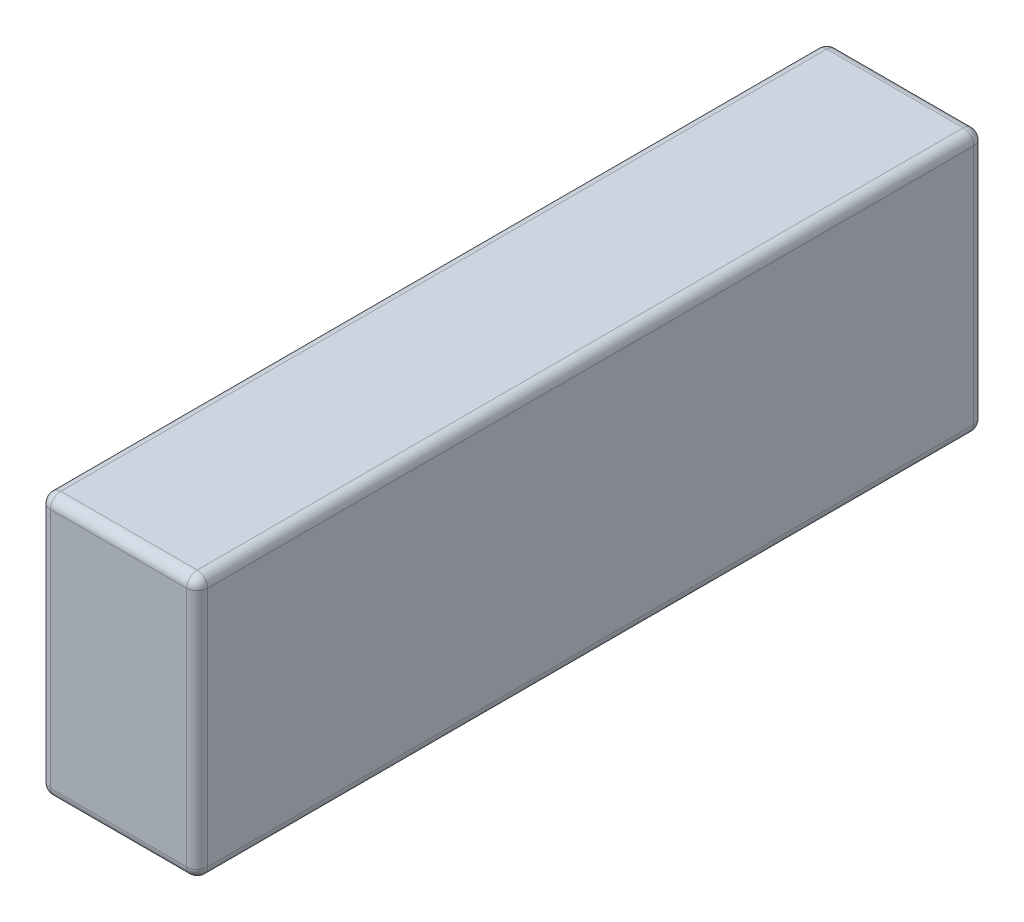
ISO-10303-21;
HEADER;
FILE_DESCRIPTION(('STEP AP214'),'2;1');
FILE_NAME('part.step','',(''),(''),'','','');
FILE_SCHEMA(('AUTOMOTIVE_DESIGN { 1 0 10303 214 1 1 1 1 }'));
ENDSEC;
DATA;
#1=APPLICATION_CONTEXT('core data for automotive mechanical design processes');
#2=APPLICATION_PROTOCOL_DEFINITION('international standard','automotive_design',2000,#1);
#3=PRODUCT_CONTEXT('',#1,'mechanical');
#4=PRODUCT('Part','Part','',(#3));
#5=PRODUCT_RELATED_PRODUCT_CATEGORY('part','',(#4));
#6=PRODUCT_DEFINITION_FORMATION('','',#4);
#7=PRODUCT_DEFINITION_CONTEXT('part definition',#1,'design');
#8=PRODUCT_DEFINITION('design','',#6,#7);
#9=PRODUCT_DEFINITION_SHAPE('','',#8);
#10=(LENGTH_UNIT() NAMED_UNIT(*) SI_UNIT(.MILLI.,.METRE.));
#11=(NAMED_UNIT(*) PLANE_ANGLE_UNIT() SI_UNIT($,.RADIAN.));
#12=(NAMED_UNIT(*) SI_UNIT($,.STERADIAN.) SOLID_ANGLE_UNIT());
#13=UNCERTAINTY_MEASURE_WITH_UNIT(LENGTH_MEASURE(1.E-05),#10,'distance_accuracy_value','');
#14=(GEOMETRIC_REPRESENTATION_CONTEXT(3) GLOBAL_UNCERTAINTY_ASSIGNED_CONTEXT((#13)) GLOBAL_UNIT_ASSIGNED_CONTEXT((#10,
#11,#12)) REPRESENTATION_CONTEXT('',''));
#15=CARTESIAN_POINT('',(0.,0.,0.));
#16=DIRECTION('',(0.,0.,1.));
#17=DIRECTION('',(1.,0.,0.));
#18=AXIS2_PLACEMENT_3D('',#15,#16,#17);
#19=CARTESIAN_POINT('',(3.,2.5,-7.5));
#20=DIRECTION('',(0.,0.,1.));
#21=DIRECTION('',(0.,-1.,0.));
#22=AXIS2_PLACEMENT_3D('',#19,#20,#21);
#23=PLANE('',#22);
#24=DIRECTION('',(0.,1.,0.));
#25=VECTOR('',#24,1.);
#26=CARTESIAN_POINT('',(2.8,-2.5,-7.5));
#27=LINE('',#26,#25);
#28=CARTESIAN_POINT('',(2.8,2.3,-7.5));
#29=VERTEX_POINT('',#28);
#30=CARTESIAN_POINT('',(2.8,-2.3,-7.5));
#31=VERTEX_POINT('',#30);
#32=EDGE_CURVE('E184',#29,#31,#27,.F.);
#33=ORIENTED_EDGE('',*,*,#32,.T.);
#34=DIRECTION('',(-1.,0.,0.));
#35=VECTOR('',#34,1.);
#36=CARTESIAN_POINT('',(3.,-2.3,-7.5));
#37=LINE('',#36,#35);
#38=CARTESIAN_POINT('',(0.2,-2.3,-7.5));
#39=VERTEX_POINT('',#38);
#40=EDGE_CURVE('E188',#31,#39,#37,.T.);
#41=ORIENTED_EDGE('',*,*,#40,.T.);
#42=DIRECTION('',(0.,1.,0.));
#43=VECTOR('',#42,1.);
#44=CARTESIAN_POINT('',(0.2,2.5,-7.5));
#45=LINE('',#44,#43);
#46=CARTESIAN_POINT('',(0.2,2.3,-7.5));
#47=VERTEX_POINT('',#46);
#48=EDGE_CURVE('E186',#39,#47,#45,.T.);
#49=ORIENTED_EDGE('',*,*,#48,.T.);
#50=DIRECTION('',(-1.,0.,0.));
#51=VECTOR('',#50,1.);
#52=CARTESIAN_POINT('',(3.,2.3,-7.5));
#53=LINE('',#52,#51);
#54=EDGE_CURVE('E182',#47,#29,#53,.F.);
#55=ORIENTED_EDGE('',*,*,#54,.T.);
#56=EDGE_LOOP('',(#33,#41,#49,#55));
#57=FACE_BOUND('',#56,.T.);
#58=ADVANCED_FACE('F33',(#57),#23,.F.);
#59=CARTESIAN_POINT('',(3.,2.5,7.5));
#60=DIRECTION('',(0.,-1.,0.));
#61=DIRECTION('',(0.,0.,-1.));
#62=AXIS2_PLACEMENT_3D('',#59,#60,#61);
#63=PLANE('',#62);
#64=DIRECTION('',(0.,0.,1.));
#65=VECTOR('',#64,1.);
#66=CARTESIAN_POINT('',(0.2,2.5,7.5));
#67=LINE('',#66,#65);
#68=CARTESIAN_POINT('',(0.2,2.5,-7.3));
#69=VERTEX_POINT('',#68);
#70=CARTESIAN_POINT('',(0.2,2.5,7.3));
#71=VERTEX_POINT('',#70);
#72=EDGE_CURVE('E42',#69,#71,#67,.T.);
#73=ORIENTED_EDGE('',*,*,#72,.T.);
#74=DIRECTION('',(-1.,0.,0.));
#75=VECTOR('',#74,1.);
#76=CARTESIAN_POINT('',(3.,2.5,7.3));
#77=LINE('',#76,#75);
#78=CARTESIAN_POINT('',(2.8,2.5,7.3));
#79=VERTEX_POINT('',#78);
#80=EDGE_CURVE('E11',#71,#79,#77,.F.);
#81=ORIENTED_EDGE('',*,*,#80,.T.);
#82=DIRECTION('',(0.,0.,1.));
#83=VECTOR('',#82,1.);
#84=CARTESIAN_POINT('',(2.8,2.5,-7.5));
#85=LINE('',#84,#83);
#86=CARTESIAN_POINT('',(2.8,2.5,-7.3));
#87=VERTEX_POINT('',#86);
#88=EDGE_CURVE('E199',#79,#87,#85,.F.);
#89=ORIENTED_EDGE('',*,*,#88,.T.);
#90=DIRECTION('',(-1.,0.,0.));
#91=VECTOR('',#90,1.);
#92=CARTESIAN_POINT('',(3.,2.5,-7.3));
#93=LINE('',#92,#91);
#94=EDGE_CURVE('E53',#87,#69,#93,.T.);
#95=ORIENTED_EDGE('',*,*,#94,.T.);
#96=EDGE_LOOP('',(#73,#81,#89,#95));
#97=FACE_BOUND('',#96,.T.);
#98=ADVANCED_FACE('F330',(#97),#63,.F.);
#99=CARTESIAN_POINT('',(3.,2.5,7.5));
#100=DIRECTION('',(0.,0.,-1.));
#101=DIRECTION('',(0.,1.,0.));
#102=AXIS2_PLACEMENT_3D('',#99,#100,#101);
#103=PLANE('',#102);
#104=DIRECTION('',(-1.,0.,0.));
#105=VECTOR('',#104,1.);
#106=CARTESIAN_POINT('',(3.,2.3,7.5));
#107=LINE('',#106,#105);
#108=CARTESIAN_POINT('',(2.8,2.3,7.5));
#109=VERTEX_POINT('',#108);
#110=CARTESIAN_POINT('',(0.2,2.3,7.5));
#111=VERTEX_POINT('',#110);
#112=EDGE_CURVE('E126',#109,#111,#107,.T.);
#113=ORIENTED_EDGE('',*,*,#112,.T.);
#114=DIRECTION('',(0.,-1.,0.));
#115=VECTOR('',#114,1.);
#116=CARTESIAN_POINT('',(0.2,2.5,7.5));
#117=LINE('',#116,#115);
#118=CARTESIAN_POINT('',(0.2,-2.3,7.5));
#119=VERTEX_POINT('',#118);
#120=EDGE_CURVE('E162',#111,#119,#117,.T.);
#121=ORIENTED_EDGE('',*,*,#120,.T.);
#122=DIRECTION('',(-1.,0.,0.));
#123=VECTOR('',#122,1.);
#124=CARTESIAN_POINT('',(3.,-2.3,7.5));
#125=LINE('',#124,#123);
#126=CARTESIAN_POINT('',(2.8,-2.3,7.5));
#127=VERTEX_POINT('',#126);
#128=EDGE_CURVE('E129',#119,#127,#125,.F.);
#129=ORIENTED_EDGE('',*,*,#128,.T.);
#130=DIRECTION('',(0.,-1.,0.));
#131=VECTOR('',#130,1.);
#132=CARTESIAN_POINT('',(2.8,2.5,7.5));
#133=LINE('',#132,#131);
#134=EDGE_CURVE('E121',#127,#109,#133,.F.);
#135=ORIENTED_EDGE('',*,*,#134,.T.);
#136=EDGE_LOOP('',(#113,#121,#129,#135));
#137=FACE_BOUND('',#136,.T.);
#138=ADVANCED_FACE('F123',(#137),#103,.F.);
#139=CARTESIAN_POINT('',(3.,-2.5,7.5));
#140=DIRECTION('',(0.,1.,0.));
#141=DIRECTION('',(0.,0.,1.));
#142=AXIS2_PLACEMENT_3D('',#139,#140,#141);
#143=PLANE('',#142);
#144=DIRECTION('',(0.,0.,-1.));
#145=VECTOR('',#144,1.);
#146=CARTESIAN_POINT('',(2.8,-2.5,7.5));
#147=LINE('',#146,#145);
#148=CARTESIAN_POINT('',(2.8,-2.5,-7.3));
#149=VERTEX_POINT('',#148);
#150=CARTESIAN_POINT('',(2.8,-2.5,7.3));
#151=VERTEX_POINT('',#150);
#152=EDGE_CURVE('E173',#149,#151,#147,.F.);
#153=ORIENTED_EDGE('',*,*,#152,.T.);
#154=DIRECTION('',(-1.,0.,0.));
#155=VECTOR('',#154,1.);
#156=CARTESIAN_POINT('',(3.,-2.5,7.3));
#157=LINE('',#156,#155);
#158=CARTESIAN_POINT('',(0.2,-2.5,7.3));
#159=VERTEX_POINT('',#158);
#160=EDGE_CURVE('E179',#151,#159,#157,.T.);
#161=ORIENTED_EDGE('',*,*,#160,.T.);
#162=DIRECTION('',(0.,0.,-1.));
#163=VECTOR('',#162,1.);
#164=CARTESIAN_POINT('',(0.2,-2.5,7.5));
#165=LINE('',#164,#163);
#166=CARTESIAN_POINT('',(0.2,-2.5,-7.3));
#167=VERTEX_POINT('',#166);
#168=EDGE_CURVE('E177',#159,#167,#165,.T.);
#169=ORIENTED_EDGE('',*,*,#168,.T.);
#170=DIRECTION('',(-1.,0.,0.));
#171=VECTOR('',#170,1.);
#172=CARTESIAN_POINT('',(3.,-2.5,-7.3));
#173=LINE('',#172,#171);
#174=EDGE_CURVE('E175',#167,#149,#173,.F.);
#175=ORIENTED_EDGE('',*,*,#174,.T.);
#176=EDGE_LOOP('',(#153,#161,#169,#175));
#177=FACE_BOUND('',#176,.T.);
#178=ADVANCED_FACE('F277',(#177),#143,.F.);
#179=CARTESIAN_POINT('',(3.,0.,0.));
#180=DIRECTION('',(1.,0.,0.));
#181=DIRECTION('',(0.,0.,-1.));
#182=AXIS2_PLACEMENT_3D('',#179,#180,#181);
#183=PLANE('',#182);
#184=DIRECTION('',(0.,-1.,0.));
#185=VECTOR('',#184,1.);
#186=CARTESIAN_POINT('',(3.,-2.5,7.3));
#187=LINE('',#186,#185);
#188=CARTESIAN_POINT('',(3.,2.3,7.3));
#189=VERTEX_POINT('',#188);
#190=CARTESIAN_POINT('',(3.,-2.3,7.3));
#191=VERTEX_POINT('',#190);
#192=EDGE_CURVE('E139',#189,#191,#187,.T.);
#193=ORIENTED_EDGE('',*,*,#192,.T.);
#194=DIRECTION('',(0.,0.,-1.));
#195=VECTOR('',#194,1.);
#196=CARTESIAN_POINT('',(3.,-2.3,-7.5));
#197=LINE('',#196,#195);
#198=CARTESIAN_POINT('',(3.,-2.3,-7.3));
#199=VERTEX_POINT('',#198);
#200=EDGE_CURVE('E196',#191,#199,#197,.T.);
#201=ORIENTED_EDGE('',*,*,#200,.T.);
#202=DIRECTION('',(0.,1.,0.));
#203=VECTOR('',#202,1.);
#204=CARTESIAN_POINT('',(3.,2.5,-7.3));
#205=LINE('',#204,#203);
#206=CARTESIAN_POINT('',(3.,2.3,-7.3));
#207=VERTEX_POINT('',#206);
#208=EDGE_CURVE('E194',#199,#207,#205,.T.);
#209=ORIENTED_EDGE('',*,*,#208,.T.);
#210=DIRECTION('',(0.,0.,1.));
#211=VECTOR('',#210,1.);
#212=CARTESIAN_POINT('',(3.,2.3,7.5));
#213=LINE('',#212,#211);
#214=EDGE_CURVE('E191',#207,#189,#213,.T.);
#215=ORIENTED_EDGE('',*,*,#214,.T.);
#216=EDGE_LOOP('',(#193,#201,#209,#215));
#217=FACE_BOUND('',#216,.T.);
#218=ADVANCED_FACE('F264',(#217),#183,.T.);
#219=CARTESIAN_POINT('',(0.,0.,0.));
#220=DIRECTION('',(1.,0.,0.));
#221=DIRECTION('',(0.,0.,-1.));
#222=AXIS2_PLACEMENT_3D('',#219,#220,#221);
#223=PLANE('',#222);
#224=DIRECTION('',(0.,0.,-1.));
#225=VECTOR('',#224,1.);
#226=CARTESIAN_POINT('',(0.,-2.3,0.));
#227=LINE('',#226,#225);
#228=CARTESIAN_POINT('',(0.,-2.3,-7.3));
#229=VERTEX_POINT('',#228);
#230=CARTESIAN_POINT('',(0.,-2.3,7.3));
#231=VERTEX_POINT('',#230);
#232=EDGE_CURVE('E168',#229,#231,#227,.F.);
#233=ORIENTED_EDGE('',*,*,#232,.T.);
#234=DIRECTION('',(0.,-1.,0.));
#235=VECTOR('',#234,1.);
#236=CARTESIAN_POINT('',(0.,0.,7.3));
#237=LINE('',#236,#235);
#238=CARTESIAN_POINT('',(0.,2.3,7.3));
#239=VERTEX_POINT('',#238);
#240=EDGE_CURVE('E170',#231,#239,#237,.F.);
#241=ORIENTED_EDGE('',*,*,#240,.T.);
#242=DIRECTION('',(0.,0.,1.));
#243=VECTOR('',#242,1.);
#244=CARTESIAN_POINT('',(0.,2.3,0.));
#245=LINE('',#244,#243);
#246=CARTESIAN_POINT('',(0.,2.3,-7.3));
#247=VERTEX_POINT('',#246);
#248=EDGE_CURVE('E164',#239,#247,#245,.F.);
#249=ORIENTED_EDGE('',*,*,#248,.T.);
#250=DIRECTION('',(0.,1.,0.));
#251=VECTOR('',#250,1.);
#252=CARTESIAN_POINT('',(0.,0.,-7.3));
#253=LINE('',#252,#251);
#254=EDGE_CURVE('E166',#247,#229,#253,.F.);
#255=ORIENTED_EDGE('',*,*,#254,.T.);
#256=EDGE_LOOP('',(#233,#241,#249,#255));
#257=FACE_BOUND('',#256,.T.);
#258=ADVANCED_FACE('F320',(#257),#223,.F.);
#259=CARTESIAN_POINT('',(2.8,0.,-7.3));
#260=DIRECTION('',(0.,-1.,0.));
#261=DIRECTION('',(0.,0.,-1.));
#262=AXIS2_PLACEMENT_3D('',#259,#260,#261);
#263=CYLINDRICAL_SURFACE('',#262,0.2);
#264=CARTESIAN_POINT('',(2.8,2.3,-7.3));
#265=DIRECTION('',(0.,1.,0.));
#266=DIRECTION('',(0.,0.,1.));
#267=AXIS2_PLACEMENT_3D('',#264,#265,#266);
#268=CIRCLE('',#267,0.2);
#269=EDGE_CURVE('E37',#207,#29,#268,.T.);
#270=ORIENTED_EDGE('',*,*,#269,.F.);
#271=ORIENTED_EDGE('',*,*,#208,.F.);
#272=CARTESIAN_POINT('',(2.8,-2.3,-7.3));
#273=DIRECTION('',(0.,-1.,0.));
#274=DIRECTION('',(1.,0.,0.));
#275=AXIS2_PLACEMENT_3D('',#272,#273,#274);
#276=CIRCLE('',#275,0.2);
#277=EDGE_CURVE('E159',#31,#199,#276,.T.);
#278=ORIENTED_EDGE('',*,*,#277,.F.);
#279=ORIENTED_EDGE('',*,*,#32,.F.);
#280=EDGE_LOOP('',(#270,#271,#278,#279));
#281=FACE_BOUND('',#280,.T.);
#282=ADVANCED_FACE('F35',(#281),#263,.T.);
#283=CARTESIAN_POINT('',(2.8,2.3,-7.3));
#284=DIRECTION('',(0.,0.,-1.));
#285=DIRECTION('',(-1.,0.,0.));
#286=AXIS2_PLACEMENT_3D('',#283,#284,#285);
#287=SPHERICAL_SURFACE('',#286,0.2);
#288=CARTESIAN_POINT('',(2.8,2.3,-7.3));
#289=DIRECTION('',(0.,0.,-1.));
#290=DIRECTION('',(-1.,0.,0.));
#291=AXIS2_PLACEMENT_3D('',#288,#289,#290);
#292=CIRCLE('',#291,0.2);
#293=EDGE_CURVE('E244',#207,#87,#292,.F.);
#294=ORIENTED_EDGE('',*,*,#293,.F.);
#295=ORIENTED_EDGE('',*,*,#269,.T.);
#296=CARTESIAN_POINT('',(2.8,2.3,-7.3));
#297=DIRECTION('',(1.,0.,0.));
#298=DIRECTION('',(0.,0.,-1.));
#299=AXIS2_PLACEMENT_3D('',#296,#297,#298);
#300=CIRCLE('',#299,0.2);
#301=EDGE_CURVE('E247',#87,#29,#300,.F.);
#302=ORIENTED_EDGE('',*,*,#301,.F.);
#303=EDGE_LOOP('',(#294,#295,#302));
#304=FACE_BOUND('',#303,.T.);
#305=ADVANCED_FACE('F287',(#304),#287,.T.);
#306=CARTESIAN_POINT('',(2.8,-2.3,-7.3));
#307=DIRECTION('',(1.,0.,0.));
#308=DIRECTION('',(0.,0.,-1.));
#309=AXIS2_PLACEMENT_3D('',#306,#307,#308);
#310=SPHERICAL_SURFACE('',#309,0.2);
#311=CARTESIAN_POINT('',(2.8,-2.3,-7.3));
#312=DIRECTION('',(1.,0.,0.));
#313=DIRECTION('',(0.,0.,-1.));
#314=AXIS2_PLACEMENT_3D('',#311,#312,#313);
#315=CIRCLE('',#314,0.2);
#316=EDGE_CURVE('E239',#31,#149,#315,.F.);
#317=ORIENTED_EDGE('',*,*,#316,.F.);
#318=ORIENTED_EDGE('',*,*,#277,.T.);
#319=CARTESIAN_POINT('',(2.8,-2.3,-7.3));
#320=DIRECTION('',(0.,0.,-1.));
#321=DIRECTION('',(-1.,0.,0.));
#322=AXIS2_PLACEMENT_3D('',#319,#320,#321);
#323=CIRCLE('',#322,0.2);
#324=EDGE_CURVE('E242',#149,#199,#323,.F.);
#325=ORIENTED_EDGE('',*,*,#324,.F.);
#326=EDGE_LOOP('',(#317,#318,#325));
#327=FACE_BOUND('',#326,.T.);
#328=ADVANCED_FACE('F255',(#327),#310,.T.);
#329=CARTESIAN_POINT('',(3.,2.3,-7.3));
#330=DIRECTION('',(-1.,0.,0.));
#331=DIRECTION('',(0.,0.,1.));
#332=AXIS2_PLACEMENT_3D('',#329,#330,#331);
#333=CYLINDRICAL_SURFACE('',#332,0.2);
#334=ORIENTED_EDGE('',*,*,#301,.T.);
#335=ORIENTED_EDGE('',*,*,#54,.F.);
#336=CARTESIAN_POINT('',(0.2,2.3,-7.3));
#337=DIRECTION('',(-1.,0.,0.));
#338=DIRECTION('',(0.,0.,1.));
#339=AXIS2_PLACEMENT_3D('',#336,#337,#338);
#340=CIRCLE('',#339,0.2);
#341=EDGE_CURVE('E233',#69,#47,#340,.T.);
#342=ORIENTED_EDGE('',*,*,#341,.F.);
#343=ORIENTED_EDGE('',*,*,#94,.F.);
#344=EDGE_LOOP('',(#334,#335,#342,#343));
#345=FACE_BOUND('',#344,.T.);
#346=ADVANCED_FACE('F290',(#345),#333,.T.);
#347=CARTESIAN_POINT('',(2.8,2.3,0.));
#348=DIRECTION('',(0.,0.,-1.));
#349=DIRECTION('',(-1.,0.,0.));
#350=AXIS2_PLACEMENT_3D('',#347,#348,#349);
#351=CYLINDRICAL_SURFACE('',#350,0.2);
#352=ORIENTED_EDGE('',*,*,#293,.T.);
#353=ORIENTED_EDGE('',*,*,#88,.F.);
#354=CARTESIAN_POINT('',(2.8,2.3,7.3));
#355=DIRECTION('',(0.,0.,1.));
#356=DIRECTION('',(1.,0.,0.));
#357=AXIS2_PLACEMENT_3D('',#354,#355,#356);
#358=CIRCLE('',#357,0.2);
#359=EDGE_CURVE('E143',#189,#79,#358,.T.);
#360=ORIENTED_EDGE('',*,*,#359,.F.);
#361=ORIENTED_EDGE('',*,*,#214,.F.);
#362=EDGE_LOOP('',(#352,#353,#360,#361));
#363=FACE_BOUND('',#362,.T.);
#364=ADVANCED_FACE('F368',(#363),#351,.T.);
#365=CARTESIAN_POINT('',(2.8,0.,7.3));
#366=DIRECTION('',(0.,1.,0.));
#367=DIRECTION('',(0.,0.,1.));
#368=AXIS2_PLACEMENT_3D('',#365,#366,#367);
#369=CYLINDRICAL_SURFACE('',#368,0.2);
#370=CARTESIAN_POINT('',(2.8,-2.3,7.3));
#371=DIRECTION('',(0.,-1.,0.));
#372=DIRECTION('',(0.,0.,-1.));
#373=AXIS2_PLACEMENT_3D('',#370,#371,#372);
#374=CIRCLE('',#373,0.2);
#375=EDGE_CURVE('E144',#191,#127,#374,.T.);
#376=ORIENTED_EDGE('',*,*,#375,.F.);
#377=ORIENTED_EDGE('',*,*,#192,.F.);
#378=CARTESIAN_POINT('',(2.8,2.3,7.3));
#379=DIRECTION('',(0.,1.,0.));
#380=DIRECTION('',(0.,0.,1.));
#381=AXIS2_PLACEMENT_3D('',#378,#379,#380);
#382=CIRCLE('',#381,0.2);
#383=EDGE_CURVE('E136',#109,#189,#382,.T.);
#384=ORIENTED_EDGE('',*,*,#383,.F.);
#385=ORIENTED_EDGE('',*,*,#134,.F.);
#386=EDGE_LOOP('',(#376,#377,#384,#385));
#387=FACE_BOUND('',#386,.T.);
#388=ADVANCED_FACE('F138',(#387),#369,.T.);
#389=CARTESIAN_POINT('',(2.8,-2.3,0.));
#390=DIRECTION('',(0.,0.,1.));
#391=DIRECTION('',(1.,0.,0.));
#392=AXIS2_PLACEMENT_3D('',#389,#390,#391);
#393=CYLINDRICAL_SURFACE('',#392,0.2);
#394=ORIENTED_EDGE('',*,*,#324,.T.);
#395=ORIENTED_EDGE('',*,*,#200,.F.);
#396=CARTESIAN_POINT('',(2.8,-2.3,7.3));
#397=DIRECTION('',(0.,0.,1.));
#398=DIRECTION('',(1.,0.,0.));
#399=AXIS2_PLACEMENT_3D('',#396,#397,#398);
#400=CIRCLE('',#399,0.2);
#401=EDGE_CURVE('E228',#151,#191,#400,.T.);
#402=ORIENTED_EDGE('',*,*,#401,.F.);
#403=ORIENTED_EDGE('',*,*,#152,.F.);
#404=EDGE_LOOP('',(#394,#395,#402,#403));
#405=FACE_BOUND('',#404,.T.);
#406=ADVANCED_FACE('F267',(#405),#393,.T.);
#407=CARTESIAN_POINT('',(3.,-2.3,-7.3));
#408=DIRECTION('',(-1.,0.,0.));
#409=DIRECTION('',(0.,0.,1.));
#410=AXIS2_PLACEMENT_3D('',#407,#408,#409);
#411=CYLINDRICAL_SURFACE('',#410,0.2);
#412=ORIENTED_EDGE('',*,*,#316,.T.);
#413=ORIENTED_EDGE('',*,*,#174,.F.);
#414=CARTESIAN_POINT('',(0.2,-2.3,-7.3));
#415=DIRECTION('',(-1.,0.,0.));
#416=DIRECTION('',(0.,0.,1.));
#417=AXIS2_PLACEMENT_3D('',#414,#415,#416);
#418=CIRCLE('',#417,0.2);
#419=EDGE_CURVE('E225',#39,#167,#418,.T.);
#420=ORIENTED_EDGE('',*,*,#419,.F.);
#421=ORIENTED_EDGE('',*,*,#40,.F.);
#422=EDGE_LOOP('',(#412,#413,#420,#421));
#423=FACE_BOUND('',#422,.T.);
#424=ADVANCED_FACE('F281',(#423),#411,.T.);
#425=CARTESIAN_POINT('',(0.2,2.5,-7.3));
#426=DIRECTION('',(0.,1.,0.));
#427=DIRECTION('',(0.,0.,1.));
#428=AXIS2_PLACEMENT_3D('',#425,#426,#427);
#429=CYLINDRICAL_SURFACE('',#428,0.2);
#430=CARTESIAN_POINT('',(0.2,2.3,-7.3));
#431=DIRECTION('',(0.,1.,0.));
#432=DIRECTION('',(0.,0.,1.));
#433=AXIS2_PLACEMENT_3D('',#430,#431,#432);
#434=CIRCLE('',#433,0.2);
#435=EDGE_CURVE('E236',#47,#247,#434,.T.);
#436=ORIENTED_EDGE('',*,*,#435,.F.);
#437=ORIENTED_EDGE('',*,*,#48,.F.);
#438=CARTESIAN_POINT('',(0.2,-2.3,-7.3));
#439=DIRECTION('',(0.,-1.,0.));
#440=DIRECTION('',(0.,0.,-1.));
#441=AXIS2_PLACEMENT_3D('',#438,#439,#440);
#442=CIRCLE('',#441,0.2);
#443=EDGE_CURVE('E223',#229,#39,#442,.T.);
#444=ORIENTED_EDGE('',*,*,#443,.F.);
#445=ORIENTED_EDGE('',*,*,#254,.F.);
#446=EDGE_LOOP('',(#436,#437,#444,#445));
#447=FACE_BOUND('',#446,.T.);
#448=ADVANCED_FACE('F318',(#447),#429,.T.);
#449=CARTESIAN_POINT('',(0.2,2.3,-7.3));
#450=DIRECTION('',(0.,0.,-1.));
#451=DIRECTION('',(-1.,0.,0.));
#452=AXIS2_PLACEMENT_3D('',#449,#450,#451);
#453=SPHERICAL_SURFACE('',#452,0.2);
#454=ORIENTED_EDGE('',*,*,#341,.T.);
#455=ORIENTED_EDGE('',*,*,#435,.T.);
#456=CARTESIAN_POINT('',(0.2,2.3,-7.3));
#457=DIRECTION('',(0.,0.,-1.));
#458=DIRECTION('',(0.,1.,0.));
#459=AXIS2_PLACEMENT_3D('',#456,#457,#458);
#460=CIRCLE('',#459,0.2);
#461=EDGE_CURVE('E150',#69,#247,#460,.F.);
#462=ORIENTED_EDGE('',*,*,#461,.F.);
#463=EDGE_LOOP('',(#454,#455,#462));
#464=FACE_BOUND('',#463,.T.);
#465=ADVANCED_FACE('F294',(#464),#453,.T.);
#466=CARTESIAN_POINT('',(2.8,2.3,7.3));
#467=DIRECTION('',(1.,0.,0.));
#468=DIRECTION('',(0.,0.,-1.));
#469=AXIS2_PLACEMENT_3D('',#466,#467,#468);
#470=SPHERICAL_SURFACE('',#469,0.2);
#471=ORIENTED_EDGE('',*,*,#383,.T.);
#472=ORIENTED_EDGE('',*,*,#359,.T.);
#473=CARTESIAN_POINT('',(2.8,2.3,7.3));
#474=DIRECTION('',(1.,0.,0.));
#475=DIRECTION('',(0.,0.,-1.));
#476=AXIS2_PLACEMENT_3D('',#473,#474,#475);
#477=CIRCLE('',#476,0.2);
#478=EDGE_CURVE('E146',#109,#79,#477,.F.);
#479=ORIENTED_EDGE('',*,*,#478,.F.);
#480=EDGE_LOOP('',(#471,#472,#479));
#481=FACE_BOUND('',#480,.T.);
#482=ADVANCED_FACE('F147',(#481),#470,.T.);
#483=CARTESIAN_POINT('',(2.8,-2.3,7.3));
#484=DIRECTION('',(1.,0.,0.));
#485=DIRECTION('',(0.,0.,-1.));
#486=AXIS2_PLACEMENT_3D('',#483,#484,#485);
#487=SPHERICAL_SURFACE('',#486,0.2);
#488=ORIENTED_EDGE('',*,*,#401,.T.);
#489=ORIENTED_EDGE('',*,*,#375,.T.);
#490=CARTESIAN_POINT('',(2.8,-2.3,7.3));
#491=DIRECTION('',(1.,0.,0.));
#492=DIRECTION('',(0.,0.,-1.));
#493=AXIS2_PLACEMENT_3D('',#490,#491,#492);
#494=CIRCLE('',#493,0.2);
#495=EDGE_CURVE('E151',#151,#127,#494,.F.);
#496=ORIENTED_EDGE('',*,*,#495,.F.);
#497=EDGE_LOOP('',(#488,#489,#496));
#498=FACE_BOUND('',#497,.T.);
#499=ADVANCED_FACE('F270',(#498),#487,.T.);
#500=CARTESIAN_POINT('',(0.2,-2.3,-7.3));
#501=DIRECTION('',(0.,0.,-1.));
#502=DIRECTION('',(0.,1.,0.));
#503=AXIS2_PLACEMENT_3D('',#500,#501,#502);
#504=SPHERICAL_SURFACE('',#503,0.2);
#505=ORIENTED_EDGE('',*,*,#443,.T.);
#506=ORIENTED_EDGE('',*,*,#419,.T.);
#507=CARTESIAN_POINT('',(0.2,-2.3,-7.3));
#508=DIRECTION('',(0.,0.,-1.));
#509=DIRECTION('',(-1.,0.,0.));
#510=AXIS2_PLACEMENT_3D('',#507,#508,#509);
#511=CIRCLE('',#510,0.2);
#512=EDGE_CURVE('E216',#229,#167,#511,.F.);
#513=ORIENTED_EDGE('',*,*,#512,.F.);
#514=EDGE_LOOP('',(#505,#506,#513));
#515=FACE_BOUND('',#514,.T.);
#516=ADVANCED_FACE('F314',(#515),#504,.T.);
#517=CARTESIAN_POINT('',(0.2,2.3,7.5));
#518=DIRECTION('',(0.,0.,1.));
#519=DIRECTION('',(1.,0.,0.));
#520=AXIS2_PLACEMENT_3D('',#517,#518,#519);
#521=CYLINDRICAL_SURFACE('',#520,0.2);
#522=ORIENTED_EDGE('',*,*,#461,.T.);
#523=ORIENTED_EDGE('',*,*,#248,.F.);
#524=CARTESIAN_POINT('',(0.2,2.3,7.3));
#525=DIRECTION('',(0.,0.,1.));
#526=DIRECTION('',(1.,0.,0.));
#527=AXIS2_PLACEMENT_3D('',#524,#525,#526);
#528=CIRCLE('',#527,0.2);
#529=EDGE_CURVE('E213',#71,#239,#528,.T.);
#530=ORIENTED_EDGE('',*,*,#529,.F.);
#531=ORIENTED_EDGE('',*,*,#72,.F.);
#532=EDGE_LOOP('',(#522,#523,#530,#531));
#533=FACE_BOUND('',#532,.T.);
#534=ADVANCED_FACE('F298',(#533),#521,.T.);
#535=CARTESIAN_POINT('',(3.,2.3,7.3));
#536=DIRECTION('',(-1.,0.,0.));
#537=DIRECTION('',(0.,0.,1.));
#538=AXIS2_PLACEMENT_3D('',#535,#536,#537);
#539=CYLINDRICAL_SURFACE('',#538,0.2);
#540=ORIENTED_EDGE('',*,*,#478,.T.);
#541=ORIENTED_EDGE('',*,*,#80,.F.);
#542=CARTESIAN_POINT('',(0.2,2.3,7.3));
#543=DIRECTION('',(-1.,0.,0.));
#544=DIRECTION('',(0.,0.,1.));
#545=AXIS2_PLACEMENT_3D('',#542,#543,#544);
#546=CIRCLE('',#545,0.2);
#547=EDGE_CURVE('E155',#111,#71,#546,.T.);
#548=ORIENTED_EDGE('',*,*,#547,.F.);
#549=ORIENTED_EDGE('',*,*,#112,.F.);
#550=EDGE_LOOP('',(#540,#541,#548,#549));
#551=FACE_BOUND('',#550,.T.);
#552=ADVANCED_FACE('F153',(#551),#539,.T.);
#553=CARTESIAN_POINT('',(3.,-2.3,7.3));
#554=DIRECTION('',(-1.,0.,0.));
#555=DIRECTION('',(0.,0.,1.));
#556=AXIS2_PLACEMENT_3D('',#553,#554,#555);
#557=CYLINDRICAL_SURFACE('',#556,0.2);
#558=ORIENTED_EDGE('',*,*,#495,.T.);
#559=ORIENTED_EDGE('',*,*,#128,.F.);
#560=CARTESIAN_POINT('',(0.2,-2.3,7.3));
#561=DIRECTION('',(-1.,0.,0.));
#562=DIRECTION('',(0.,0.,1.));
#563=AXIS2_PLACEMENT_3D('',#560,#561,#562);
#564=CIRCLE('',#563,0.2);
#565=EDGE_CURVE('E209',#159,#119,#564,.T.);
#566=ORIENTED_EDGE('',*,*,#565,.F.);
#567=ORIENTED_EDGE('',*,*,#160,.F.);
#568=EDGE_LOOP('',(#558,#559,#566,#567));
#569=FACE_BOUND('',#568,.T.);
#570=ADVANCED_FACE('F274',(#569),#557,.T.);
#571=CARTESIAN_POINT('',(0.2,-2.3,7.5));
#572=DIRECTION('',(0.,0.,-1.));
#573=DIRECTION('',(-1.,0.,0.));
#574=AXIS2_PLACEMENT_3D('',#571,#572,#573);
#575=CYLINDRICAL_SURFACE('',#574,0.2);
#576=ORIENTED_EDGE('',*,*,#512,.T.);
#577=ORIENTED_EDGE('',*,*,#168,.F.);
#578=CARTESIAN_POINT('',(0.2,-2.3,7.3));
#579=DIRECTION('',(0.,0.,1.));
#580=DIRECTION('',(1.,0.,0.));
#581=AXIS2_PLACEMENT_3D('',#578,#579,#580);
#582=CIRCLE('',#581,0.2);
#583=EDGE_CURVE('E207',#231,#159,#582,.T.);
#584=ORIENTED_EDGE('',*,*,#583,.F.);
#585=ORIENTED_EDGE('',*,*,#232,.F.);
#586=EDGE_LOOP('',(#576,#577,#584,#585));
#587=FACE_BOUND('',#586,.T.);
#588=ADVANCED_FACE('F311',(#587),#575,.T.);
#589=CARTESIAN_POINT('',(0.2,2.3,7.3));
#590=DIRECTION('',(0.,1.,0.));
#591=DIRECTION('',(-1.,0.,0.));
#592=AXIS2_PLACEMENT_3D('',#589,#590,#591);
#593=SPHERICAL_SURFACE('',#592,0.2);
#594=ORIENTED_EDGE('',*,*,#547,.T.);
#595=ORIENTED_EDGE('',*,*,#529,.T.);
#596=CARTESIAN_POINT('',(0.2,2.3,7.3));
#597=DIRECTION('',(0.,1.,0.));
#598=DIRECTION('',(0.,0.,1.));
#599=AXIS2_PLACEMENT_3D('',#596,#597,#598);
#600=CIRCLE('',#599,0.2);
#601=EDGE_CURVE('E205',#111,#239,#600,.F.);
#602=ORIENTED_EDGE('',*,*,#601,.F.);
#603=EDGE_LOOP('',(#594,#595,#602));
#604=FACE_BOUND('',#603,.T.);
#605=ADVANCED_FACE('F300',(#604),#593,.T.);
#606=CARTESIAN_POINT('',(0.2,-2.3,7.3));
#607=DIRECTION('',(0.,-1.,0.));
#608=DIRECTION('',(1.,0.,0.));
#609=AXIS2_PLACEMENT_3D('',#606,#607,#608);
#610=SPHERICAL_SURFACE('',#609,0.2);
#611=ORIENTED_EDGE('',*,*,#583,.T.);
#612=ORIENTED_EDGE('',*,*,#565,.T.);
#613=CARTESIAN_POINT('',(0.2,-2.3,7.3));
#614=DIRECTION('',(0.,-1.,0.));
#615=DIRECTION('',(0.,0.,-1.));
#616=AXIS2_PLACEMENT_3D('',#613,#614,#615);
#617=CIRCLE('',#616,0.2);
#618=EDGE_CURVE('E203',#231,#119,#617,.F.);
#619=ORIENTED_EDGE('',*,*,#618,.F.);
#620=EDGE_LOOP('',(#611,#612,#619));
#621=FACE_BOUND('',#620,.T.);
#622=ADVANCED_FACE('F307',(#621),#610,.T.);
#623=CARTESIAN_POINT('',(0.2,2.5,7.3));
#624=DIRECTION('',(0.,-1.,0.));
#625=DIRECTION('',(0.,0.,-1.));
#626=AXIS2_PLACEMENT_3D('',#623,#624,#625);
#627=CYLINDRICAL_SURFACE('',#626,0.2);
#628=ORIENTED_EDGE('',*,*,#601,.T.);
#629=ORIENTED_EDGE('',*,*,#240,.F.);
#630=ORIENTED_EDGE('',*,*,#618,.T.);
#631=ORIENTED_EDGE('',*,*,#120,.F.);
#632=EDGE_LOOP('',(#628,#629,#630,#631));
#633=FACE_BOUND('',#632,.T.);
#634=ADVANCED_FACE('F304',(#633),#627,.T.);
#635=CLOSED_SHELL('',(#58,#98,#138,#178,#218,#258,#282,#305,#328,#346,#364,#388,#406,#424,#448,
#465,#482,#499,#516,#534,#552,#570,#588,#605,#622,#634));
#636=MANIFOLD_SOLID_BREP('B2',#635);
#637=ADVANCED_BREP_SHAPE_REPRESENTATION('',(#18,#636),#14);
#638=SHAPE_DEFINITION_REPRESENTATION(#9,#637);
ENDSEC;
END-ISO-10303-21;
